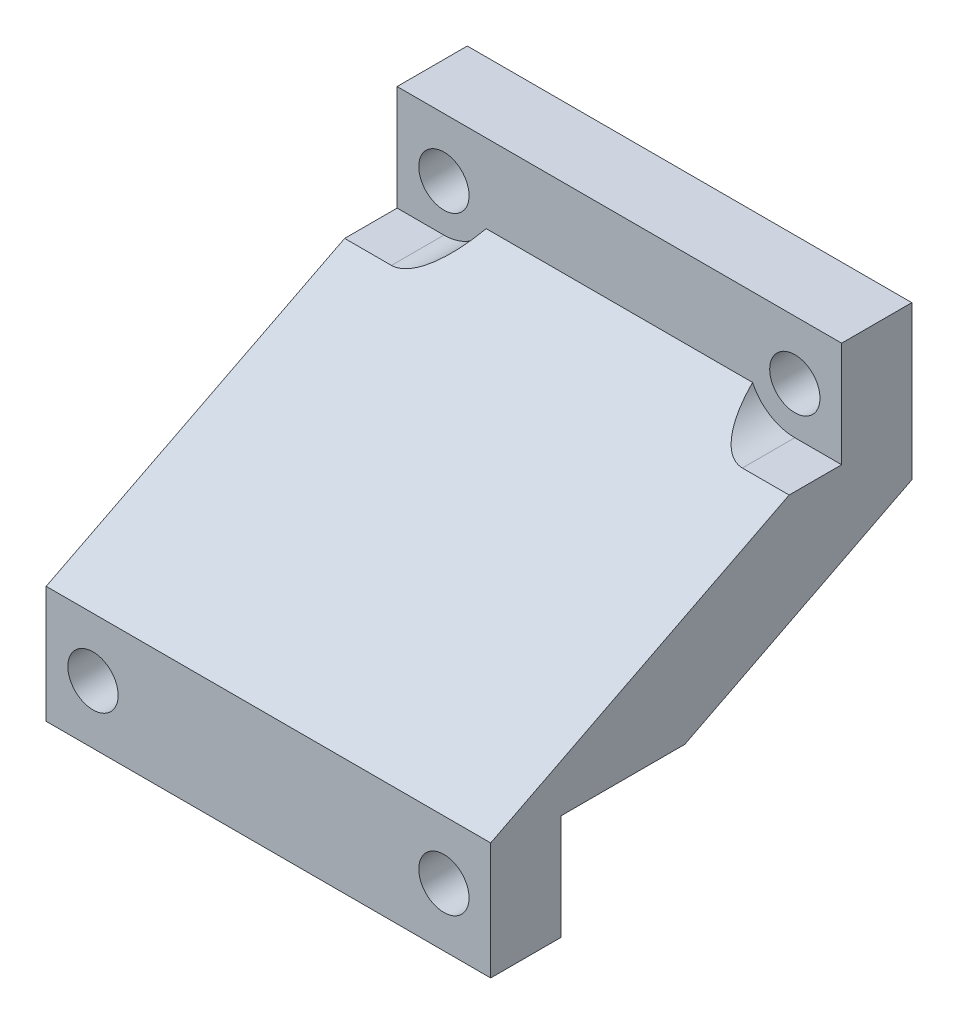
ISO-10303-21;
HEADER;
FILE_DESCRIPTION(('STEP AP214'),'2;1');
FILE_NAME('part.step','',(''),(''),'','','');
FILE_SCHEMA(('AUTOMOTIVE_DESIGN { 1 0 10303 214 1 1 1 1 }'));
ENDSEC;
DATA;
#1=APPLICATION_CONTEXT('core data for automotive mechanical design processes');
#2=APPLICATION_PROTOCOL_DEFINITION('international standard','automotive_design',2000,#1);
#3=PRODUCT_CONTEXT('',#1,'mechanical');
#4=PRODUCT('Part','Part','',(#3));
#5=PRODUCT_RELATED_PRODUCT_CATEGORY('part','',(#4));
#6=PRODUCT_DEFINITION_FORMATION('','',#4);
#7=PRODUCT_DEFINITION_CONTEXT('part definition',#1,'design');
#8=PRODUCT_DEFINITION('design','',#6,#7);
#9=PRODUCT_DEFINITION_SHAPE('','',#8);
#10=(LENGTH_UNIT() NAMED_UNIT(*) SI_UNIT(.MILLI.,.METRE.));
#11=(NAMED_UNIT(*) PLANE_ANGLE_UNIT() SI_UNIT($,.RADIAN.));
#12=(NAMED_UNIT(*) SI_UNIT($,.STERADIAN.) SOLID_ANGLE_UNIT());
#13=UNCERTAINTY_MEASURE_WITH_UNIT(LENGTH_MEASURE(1.E-05),#10,'distance_accuracy_value','');
#14=(GEOMETRIC_REPRESENTATION_CONTEXT(3) GLOBAL_UNCERTAINTY_ASSIGNED_CONTEXT((#13)) GLOBAL_UNIT_ASSIGNED_CONTEXT((#10,
#11,#12)) REPRESENTATION_CONTEXT('',''));
#15=CARTESIAN_POINT('',(0.,0.,0.));
#16=DIRECTION('',(0.,0.,1.));
#17=DIRECTION('',(1.,0.,0.));
#18=AXIS2_PLACEMENT_3D('',#15,#16,#17);
#19=CARTESIAN_POINT('',(-19.,0.,0.));
#20=DIRECTION('',(1.,0.,0.));
#21=DIRECTION('',(0.,0.,-1.));
#22=AXIS2_PLACEMENT_3D('',#19,#20,#21);
#23=PLANE('',#22);
#24=DIRECTION('',(0.,0.,-1.));
#25=VECTOR('',#24,1.);
#26=CARTESIAN_POINT('',(-19.,23.,5.99999999999999));
#27=LINE('',#26,#25);
#28=CARTESIAN_POINT('',(-19.,23.,-25.5139365715669));
#29=VERTEX_POINT('',#28);
#30=CARTESIAN_POINT('',(-19.,23.,-30.));
#31=VERTEX_POINT('',#30);
#32=EDGE_CURVE('E195',#29,#31,#27,.T.);
#33=ORIENTED_EDGE('',*,*,#32,.T.);
#34=DIRECTION('',(0.,-1.,0.));
#35=VECTOR('',#34,1.);
#36=CARTESIAN_POINT('',(-19.,32.,-30.));
#37=LINE('',#36,#35);
#38=CARTESIAN_POINT('',(-19.,32.,-30.));
#39=VERTEX_POINT('',#38);
#40=EDGE_CURVE('E138',#39,#31,#37,.T.);
#41=ORIENTED_EDGE('',*,*,#40,.F.);
#42=DIRECTION('',(0.,0.,1.));
#43=VECTOR('',#42,1.);
#44=CARTESIAN_POINT('',(-19.,32.,-36.));
#45=LINE('',#44,#43);
#46=CARTESIAN_POINT('',(-19.,32.,-36.));
#47=VERTEX_POINT('',#46);
#48=EDGE_CURVE('E135',#47,#39,#45,.T.);
#49=ORIENTED_EDGE('',*,*,#48,.F.);
#50=DIRECTION('',(0.,1.,0.));
#51=VECTOR('',#50,1.);
#52=CARTESIAN_POINT('',(-19.,18.8857634848329,-36.));
#53=LINE('',#52,#51);
#54=CARTESIAN_POINT('',(-19.,18.8857634848329,-36.));
#55=VERTEX_POINT('',#54);
#56=EDGE_CURVE('E133',#55,#47,#53,.T.);
#57=ORIENTED_EDGE('',*,*,#56,.F.);
#58=DIRECTION('',(0.,0.453990499739548,-0.891006524188367));
#59=VECTOR('',#58,1.);
#60=CARTESIAN_POINT('',(-19.,3.6,-6.));
#61=LINE('',#60,#59);
#62=CARTESIAN_POINT('',(-19.,9.,-16.5980967297278));
#63=VERTEX_POINT('',#62);
#64=EDGE_CURVE('E130',#63,#55,#61,.T.);
#65=ORIENTED_EDGE('',*,*,#64,.F.);
#66=DIRECTION('',(0.,0.,-1.));
#67=VECTOR('',#66,1.);
#68=CARTESIAN_POINT('',(-19.,9.,0.));
#69=LINE('',#68,#67);
#70=CARTESIAN_POINT('',(-19.,9.,-6.));
#71=VERTEX_POINT('',#70);
#72=EDGE_CURVE('E161',#71,#63,#69,.T.);
#73=ORIENTED_EDGE('',*,*,#72,.F.);
#74=DIRECTION('',(0.,1.,0.));
#75=VECTOR('',#74,1.);
#76=CARTESIAN_POINT('',(-19.,0.,-6.));
#77=LINE('',#76,#75);
#78=CARTESIAN_POINT('',(-19.,0.,-6.));
#79=VERTEX_POINT('',#78);
#80=EDGE_CURVE('E128',#79,#71,#77,.T.);
#81=ORIENTED_EDGE('',*,*,#80,.F.);
#82=DIRECTION('',(0.,0.,-1.));
#83=VECTOR('',#82,1.);
#84=CARTESIAN_POINT('',(-19.,0.,0.));
#85=LINE('',#84,#83);
#86=CARTESIAN_POINT('',(-19.,0.,0.));
#87=VERTEX_POINT('',#86);
#88=EDGE_CURVE('E144',#87,#79,#85,.T.);
#89=ORIENTED_EDGE('',*,*,#88,.F.);
#90=DIRECTION('',(0.,1.,0.));
#91=VECTOR('',#90,1.);
#92=CARTESIAN_POINT('',(-19.,0.,0.));
#93=LINE('',#92,#91);
#94=CARTESIAN_POINT('',(-19.,10.,0.));
#95=VERTEX_POINT('',#94);
#96=EDGE_CURVE('E142',#87,#95,#93,.T.);
#97=ORIENTED_EDGE('',*,*,#96,.T.);
#98=DIRECTION('',(0.,-0.453990499739548,0.891006524188367));
#99=VECTOR('',#98,1.);
#100=CARTESIAN_POINT('',(-19.,25.2857634848329,-30.));
#101=LINE('',#100,#99);
#102=EDGE_CURVE('E117',#29,#95,#101,.T.);
#103=ORIENTED_EDGE('',*,*,#102,.F.);
#104=EDGE_LOOP('',(#33,#41,#49,#57,#65,#73,#81,#89,#97,#103));
#105=FACE_BOUND('',#104,.T.);
#106=ADVANCED_FACE('F33',(#105),#23,.F.);
#107=CARTESIAN_POINT('',(19.,25.2857634848329,-30.));
#108=DIRECTION('',(0.,-0.891006524188367,-0.453990499739548));
#109=DIRECTION('',(0.,0.453990499739548,-0.891006524188367));
#110=AXIS2_PLACEMENT_3D('',#107,#108,#109);
#111=PLANE('',#110);
#112=DIRECTION('',(-1.,0.,0.));
#113=VECTOR('',#112,1.);
#114=CARTESIAN_POINT('',(19.,25.2857634848329,-30.));
#115=LINE('',#114,#113);
#116=CARTESIAN_POINT('',(11.3859450515982,25.2857634848329,-30.));
#117=VERTEX_POINT('',#116);
#118=CARTESIAN_POINT('',(-11.3859450515982,25.2857634848329,-30.));
#119=VERTEX_POINT('',#118);
#120=EDGE_CURVE('E121',#117,#119,#115,.T.);
#121=ORIENTED_EDGE('',*,*,#120,.T.);
#122=CARTESIAN_POINT('',(-15.,27.,-33.3643785935875));
#123=DIRECTION('',(0.,-0.891006524188367,-0.453990499739548));
#124=DIRECTION('',(0.,0.453990499739548,-0.891006524188367));
#125=AXIS2_PLACEMENT_3D('',#122,#123,#124);
#126=ELLIPSE('',#125,8.81075705834104,4.);
#127=CARTESIAN_POINT('',(-15.,23.,-25.5139365715669));
#128=VERTEX_POINT('',#127);
#129=EDGE_CURVE('E11',#119,#128,#126,.T.);
#130=ORIENTED_EDGE('',*,*,#129,.T.);
#131=DIRECTION('',(1.,0.,0.));
#132=VECTOR('',#131,1.);
#133=CARTESIAN_POINT('',(19.,23.,-25.5139365715669));
#134=LINE('',#133,#132);
#135=EDGE_CURVE('E42',#29,#128,#134,.T.);
#136=ORIENTED_EDGE('',*,*,#135,.F.);
#137=ORIENTED_EDGE('',*,*,#102,.T.);
#138=DIRECTION('',(-1.,0.,0.));
#139=VECTOR('',#138,1.);
#140=CARTESIAN_POINT('',(19.,10.,0.));
#141=LINE('',#140,#139);
#142=CARTESIAN_POINT('',(19.,10.,0.));
#143=VERTEX_POINT('',#142);
#144=EDGE_CURVE('E112',#143,#95,#141,.T.);
#145=ORIENTED_EDGE('',*,*,#144,.F.);
#146=DIRECTION('',(0.,-0.453990499739548,0.891006524188367));
#147=VECTOR('',#146,1.);
#148=CARTESIAN_POINT('',(19.,25.2857634848329,-30.));
#149=LINE('',#148,#147);
#150=CARTESIAN_POINT('',(19.,23.,-25.5139365715669));
#151=VERTEX_POINT('',#150);
#152=EDGE_CURVE('E98',#151,#143,#149,.T.);
#153=ORIENTED_EDGE('',*,*,#152,.F.);
#154=DIRECTION('',(-1.,0.,0.));
#155=VECTOR('',#154,1.);
#156=CARTESIAN_POINT('',(19.,23.,-25.5139365715669));
#157=LINE('',#156,#155);
#158=CARTESIAN_POINT('',(15.,23.,-25.5139365715669));
#159=VERTEX_POINT('',#158);
#160=EDGE_CURVE('E178',#151,#159,#157,.T.);
#161=ORIENTED_EDGE('',*,*,#160,.T.);
#162=CARTESIAN_POINT('',(15.,27.,-33.3643785935875));
#163=DIRECTION('',(0.,-0.891006524188367,-0.453990499739548));
#164=DIRECTION('',(0.,0.453990499739548,-0.891006524188367));
#165=AXIS2_PLACEMENT_3D('',#162,#163,#164);
#166=ELLIPSE('',#165,8.81075705834104,4.);
#167=EDGE_CURVE('E180',#117,#159,#166,.F.);
#168=ORIENTED_EDGE('',*,*,#167,.F.);
#169=EDGE_LOOP('',(#121,#130,#136,#137,#145,#153,#161,#168));
#170=FACE_BOUND('',#169,.T.);
#171=ADVANCED_FACE('F114',(#170),#111,.F.);
#172=CARTESIAN_POINT('',(15.,27.,-36.));
#173=DIRECTION('',(0.,0.,1.));
#174=DIRECTION('',(1.,0.,0.));
#175=AXIS2_PLACEMENT_3D('',#172,#173,#174);
#176=CYLINDRICAL_SURFACE('',#175,2.15);
#177=CARTESIAN_POINT('',(15.,27.,-36.));
#178=DIRECTION('',(0.,0.,1.));
#179=DIRECTION('',(-1.,0.,0.));
#180=AXIS2_PLACEMENT_3D('',#177,#178,#179);
#181=CIRCLE('',#180,2.15);
#182=CARTESIAN_POINT('',(12.85,27.,-36.));
#183=VERTEX_POINT('',#182);
#184=EDGE_CURVE('E302',#183,#183,#181,.T.);
#185=ORIENTED_EDGE('',*,*,#184,.F.);
#186=EDGE_LOOP('',(#185));
#187=FACE_BOUND('',#186,.T.);
#188=CARTESIAN_POINT('',(15.,27.,-30.));
#189=DIRECTION('',(0.,0.,-1.));
#190=DIRECTION('',(-1.,0.,0.));
#191=AXIS2_PLACEMENT_3D('',#188,#189,#190);
#192=CIRCLE('',#191,2.15);
#193=CARTESIAN_POINT('',(12.85,27.,-30.));
#194=VERTEX_POINT('',#193);
#195=EDGE_CURVE('E309',#194,#194,#192,.T.);
#196=ORIENTED_EDGE('',*,*,#195,.F.);
#197=EDGE_LOOP('',(#196));
#198=FACE_BOUND('',#197,.T.);
#199=ADVANCED_FACE('F383',(#187,#198),#176,.F.);
#200=CARTESIAN_POINT('',(19.,3.6,-6.));
#201=DIRECTION('',(0.,0.891006524188367,0.453990499739548));
#202=DIRECTION('',(0.,-0.453990499739548,0.891006524188367));
#203=AXIS2_PLACEMENT_3D('',#200,#201,#202);
#204=PLANE('',#203);
#205=DIRECTION('',(0.,0.453990499739548,-0.891006524188367));
#206=VECTOR('',#205,1.);
#207=CARTESIAN_POINT('',(11.,3.6,-6.));
#208=LINE('',#207,#206);
#209=CARTESIAN_POINT('',(11.,3.6,-6.));
#210=VERTEX_POINT('',#209);
#211=CARTESIAN_POINT('',(11.,4.99999999999997,-8.74765470770715));
#212=VERTEX_POINT('',#211);
#213=EDGE_CURVE('E175',#210,#212,#208,.T.);
#214=ORIENTED_EDGE('',*,*,#213,.F.);
#215=DIRECTION('',(-1.,0.,0.));
#216=VECTOR('',#215,1.);
#217=CARTESIAN_POINT('',(19.,3.6,-6.));
#218=LINE('',#217,#216);
#219=CARTESIAN_POINT('',(-11.,3.6,-6.));
#220=VERTEX_POINT('',#219);
#221=EDGE_CURVE('E158',#210,#220,#218,.T.);
#222=ORIENTED_EDGE('',*,*,#221,.T.);
#223=DIRECTION('',(0.,-0.453990499739548,0.891006524188367));
#224=VECTOR('',#223,1.);
#225=CARTESIAN_POINT('',(-11.,3.6,-6.));
#226=LINE('',#225,#224);
#227=CARTESIAN_POINT('',(-11.,4.99999999999997,-8.74765470770715));
#228=VERTEX_POINT('',#227);
#229=EDGE_CURVE('E166',#228,#220,#226,.T.);
#230=ORIENTED_EDGE('',*,*,#229,.F.);
#231=CARTESIAN_POINT('',(-15.,5.,-8.74765470770719));
#232=DIRECTION('',(0.,0.891006524188367,0.453990499739548));
#233=DIRECTION('',(0.,-0.453990499739548,0.891006524188367));
#234=AXIS2_PLACEMENT_3D('',#231,#232,#233);
#235=ELLIPSE('',#234,8.81075705834104,4.);
#236=CARTESIAN_POINT('',(-15.,9.,-16.5980967297278));
#237=VERTEX_POINT('',#236);
#238=EDGE_CURVE('E169',#237,#228,#235,.F.);
#239=ORIENTED_EDGE('',*,*,#238,.F.);
#240=DIRECTION('',(1.,0.,0.));
#241=VECTOR('',#240,1.);
#242=CARTESIAN_POINT('',(19.,9.,-16.5980967297278));
#243=LINE('',#242,#241);
#244=EDGE_CURVE('E281',#63,#237,#243,.T.);
#245=ORIENTED_EDGE('',*,*,#244,.F.);
#246=ORIENTED_EDGE('',*,*,#64,.T.);
#247=DIRECTION('',(-1.,0.,0.));
#248=VECTOR('',#247,1.);
#249=CARTESIAN_POINT('',(19.,18.8857634848329,-36.));
#250=LINE('',#249,#248);
#251=CARTESIAN_POINT('',(19.,18.8857634848329,-36.));
#252=VERTEX_POINT('',#251);
#253=EDGE_CURVE('E155',#252,#55,#250,.T.);
#254=ORIENTED_EDGE('',*,*,#253,.F.);
#255=DIRECTION('',(0.,0.453990499739548,-0.891006524188367));
#256=VECTOR('',#255,1.);
#257=CARTESIAN_POINT('',(19.,3.6,-6.));
#258=LINE('',#257,#256);
#259=CARTESIAN_POINT('',(19.,9.,-16.5980967297278));
#260=VERTEX_POINT('',#259);
#261=EDGE_CURVE('E87',#260,#252,#258,.T.);
#262=ORIENTED_EDGE('',*,*,#261,.F.);
#263=DIRECTION('',(1.,0.,0.));
#264=VECTOR('',#263,1.);
#265=CARTESIAN_POINT('',(19.,9.,-16.5980967297278));
#266=LINE('',#265,#264);
#267=CARTESIAN_POINT('',(15.,9.,-16.5980967297278));
#268=VERTEX_POINT('',#267);
#269=EDGE_CURVE('E286',#268,#260,#266,.T.);
#270=ORIENTED_EDGE('',*,*,#269,.F.);
#271=CARTESIAN_POINT('',(15.,5.,-8.74765470770719));
#272=DIRECTION('',(0.,0.891006524188367,0.453990499739548));
#273=DIRECTION('',(0.,-0.453990499739548,0.891006524188367));
#274=AXIS2_PLACEMENT_3D('',#271,#272,#273);
#275=ELLIPSE('',#274,8.81075705834104,4.);
#276=EDGE_CURVE('E172',#212,#268,#275,.F.);
#277=ORIENTED_EDGE('',*,*,#276,.F.);
#278=EDGE_LOOP('',(#214,#222,#230,#239,#245,#246,#254,#262,#270,#277));
#279=FACE_BOUND('',#278,.T.);
#280=ADVANCED_FACE('F285',(#279),#204,.F.);
#281=CARTESIAN_POINT('',(19.,0.,0.));
#282=DIRECTION('',(1.,0.,0.));
#283=DIRECTION('',(0.,0.,-1.));
#284=AXIS2_PLACEMENT_3D('',#281,#282,#283);
#285=PLANE('',#284);
#286=DIRECTION('',(0.,0.,-1.));
#287=VECTOR('',#286,1.);
#288=CARTESIAN_POINT('',(19.,23.,5.99999999999999));
#289=LINE('',#288,#287);
#290=CARTESIAN_POINT('',(19.,23.,-30.));
#291=VERTEX_POINT('',#290);
#292=EDGE_CURVE('E106',#151,#291,#289,.T.);
#293=ORIENTED_EDGE('',*,*,#292,.F.);
#294=ORIENTED_EDGE('',*,*,#152,.T.);
#295=DIRECTION('',(0.,1.,0.));
#296=VECTOR('',#295,1.);
#297=CARTESIAN_POINT('',(19.,0.,0.));
#298=LINE('',#297,#296);
#299=CARTESIAN_POINT('',(19.,0.,0.));
#300=VERTEX_POINT('',#299);
#301=EDGE_CURVE('E102',#300,#143,#298,.T.);
#302=ORIENTED_EDGE('',*,*,#301,.F.);
#303=DIRECTION('',(0.,0.,-1.));
#304=VECTOR('',#303,1.);
#305=CARTESIAN_POINT('',(19.,0.,0.));
#306=LINE('',#305,#304);
#307=CARTESIAN_POINT('',(19.,0.,-6.));
#308=VERTEX_POINT('',#307);
#309=EDGE_CURVE('E50',#300,#308,#306,.T.);
#310=ORIENTED_EDGE('',*,*,#309,.T.);
#311=DIRECTION('',(0.,1.,0.));
#312=VECTOR('',#311,1.);
#313=CARTESIAN_POINT('',(19.,0.,-6.));
#314=LINE('',#313,#312);
#315=CARTESIAN_POINT('',(19.,9.,-6.));
#316=VERTEX_POINT('',#315);
#317=EDGE_CURVE('E146',#308,#316,#314,.T.);
#318=ORIENTED_EDGE('',*,*,#317,.T.);
#319=DIRECTION('',(0.,0.,-1.));
#320=VECTOR('',#319,1.);
#321=CARTESIAN_POINT('',(19.,9.,0.));
#322=LINE('',#321,#320);
#323=EDGE_CURVE('E164',#316,#260,#322,.T.);
#324=ORIENTED_EDGE('',*,*,#323,.T.);
#325=ORIENTED_EDGE('',*,*,#261,.T.);
#326=DIRECTION('',(0.,1.,0.));
#327=VECTOR('',#326,1.);
#328=CARTESIAN_POINT('',(19.,18.8857634848329,-36.));
#329=LINE('',#328,#327);
#330=CARTESIAN_POINT('',(19.,32.,-36.));
#331=VERTEX_POINT('',#330);
#332=EDGE_CURVE('E318',#252,#331,#329,.T.);
#333=ORIENTED_EDGE('',*,*,#332,.T.);
#334=DIRECTION('',(0.,0.,1.));
#335=VECTOR('',#334,1.);
#336=CARTESIAN_POINT('',(19.,32.,-36.));
#337=LINE('',#336,#335);
#338=CARTESIAN_POINT('',(19.,32.,-30.));
#339=VERTEX_POINT('',#338);
#340=EDGE_CURVE('E320',#331,#339,#337,.T.);
#341=ORIENTED_EDGE('',*,*,#340,.T.);
#342=DIRECTION('',(0.,-1.,0.));
#343=VECTOR('',#342,1.);
#344=CARTESIAN_POINT('',(19.,32.,-30.));
#345=LINE('',#344,#343);
#346=EDGE_CURVE('E109',#339,#291,#345,.T.);
#347=ORIENTED_EDGE('',*,*,#346,.T.);
#348=EDGE_LOOP('',(#293,#294,#302,#310,#318,#324,#325,#333,#341,#347));
#349=FACE_BOUND('',#348,.T.);
#350=ADVANCED_FACE('F100',(#349),#285,.T.);
#351=CARTESIAN_POINT('',(19.,0.,-6.));
#352=DIRECTION('',(0.,0.,1.));
#353=DIRECTION('',(1.,0.,0.));
#354=AXIS2_PLACEMENT_3D('',#351,#352,#353);
#355=PLANE('',#354);
#356=CARTESIAN_POINT('',(-15.,5.,-6.));
#357=DIRECTION('',(0.,0.,1.));
#358=DIRECTION('',(1.,0.,0.));
#359=AXIS2_PLACEMENT_3D('',#356,#357,#358);
#360=CIRCLE('',#359,2.15);
#361=CARTESIAN_POINT('',(-12.85,5.,-6.));
#362=VERTEX_POINT('',#361);
#363=EDGE_CURVE('E300',#362,#362,#360,.F.);
#364=ORIENTED_EDGE('',*,*,#363,.F.);
#365=EDGE_LOOP('',(#364));
#366=FACE_BOUND('',#365,.T.);
#367=DIRECTION('',(0.,-1.,0.));
#368=VECTOR('',#367,1.);
#369=CARTESIAN_POINT('',(-11.,4.99999999999997,-6.));
#370=LINE('',#369,#368);
#371=CARTESIAN_POINT('',(-11.,4.99999999999997,-6.));
#372=VERTEX_POINT('',#371);
#373=EDGE_CURVE('E349',#372,#220,#370,.T.);
#374=ORIENTED_EDGE('',*,*,#373,.T.);
#375=ORIENTED_EDGE('',*,*,#221,.F.);
#376=DIRECTION('',(0.,1.,0.));
#377=VECTOR('',#376,1.);
#378=CARTESIAN_POINT('',(11.,4.99999999999997,-6.));
#379=LINE('',#378,#377);
#380=CARTESIAN_POINT('',(11.,4.99999999999997,-6.));
#381=VERTEX_POINT('',#380);
#382=EDGE_CURVE('E271',#210,#381,#379,.T.);
#383=ORIENTED_EDGE('',*,*,#382,.T.);
#384=CARTESIAN_POINT('',(15.,5.,-6.));
#385=DIRECTION('',(0.,0.,-1.));
#386=DIRECTION('',(1.,0.,0.));
#387=AXIS2_PLACEMENT_3D('',#384,#385,#386);
#388=CIRCLE('',#387,4.);
#389=CARTESIAN_POINT('',(15.,9.,-6.));
#390=VERTEX_POINT('',#389);
#391=EDGE_CURVE('E280',#381,#390,#388,.T.);
#392=ORIENTED_EDGE('',*,*,#391,.T.);
#393=DIRECTION('',(1.,0.,0.));
#394=VECTOR('',#393,1.);
#395=CARTESIAN_POINT('',(19.,9.,-6.));
#396=LINE('',#395,#394);
#397=EDGE_CURVE('E339',#390,#316,#396,.T.);
#398=ORIENTED_EDGE('',*,*,#397,.T.);
#399=ORIENTED_EDGE('',*,*,#317,.F.);
#400=DIRECTION('',(-1.,0.,0.));
#401=VECTOR('',#400,1.);
#402=CARTESIAN_POINT('',(19.,0.,-6.));
#403=LINE('',#402,#401);
#404=EDGE_CURVE('E80',#308,#79,#403,.T.);
#405=ORIENTED_EDGE('',*,*,#404,.T.);
#406=ORIENTED_EDGE('',*,*,#80,.T.);
#407=DIRECTION('',(1.,0.,0.));
#408=VECTOR('',#407,1.);
#409=CARTESIAN_POINT('',(-19.,9.,-6.));
#410=LINE('',#409,#408);
#411=CARTESIAN_POINT('',(-15.,9.,-6.));
#412=VERTEX_POINT('',#411);
#413=EDGE_CURVE('E343',#71,#412,#410,.T.);
#414=ORIENTED_EDGE('',*,*,#413,.T.);
#415=CARTESIAN_POINT('',(-15.,5.,-6.));
#416=DIRECTION('',(0.,0.,-1.));
#417=DIRECTION('',(-1.,0.,0.));
#418=AXIS2_PLACEMENT_3D('',#415,#416,#417);
#419=CIRCLE('',#418,4.);
#420=EDGE_CURVE('E346',#412,#372,#419,.T.);
#421=ORIENTED_EDGE('',*,*,#420,.T.);
#422=EDGE_LOOP('',(#374,#375,#383,#392,#398,#399,#405,#406,#414,#421));
#423=FACE_BOUND('',#422,.T.);
#424=CARTESIAN_POINT('',(15.,5.,-6.));
#425=DIRECTION('',(0.,0.,1.));
#426=DIRECTION('',(1.,0.,0.));
#427=AXIS2_PLACEMENT_3D('',#424,#425,#426);
#428=CIRCLE('',#427,2.15);
#429=CARTESIAN_POINT('',(17.15,5.,-6.));
#430=VERTEX_POINT('',#429);
#431=EDGE_CURVE('E292',#430,#430,#428,.F.);
#432=ORIENTED_EDGE('',*,*,#431,.F.);
#433=EDGE_LOOP('',(#432));
#434=FACE_BOUND('',#433,.T.);
#435=ADVANCED_FACE('F35',(#366,#423,#434),#355,.F.);
#436=CARTESIAN_POINT('',(19.,18.8857634848329,-36.));
#437=DIRECTION('',(0.,0.,1.));
#438=DIRECTION('',(1.,0.,0.));
#439=AXIS2_PLACEMENT_3D('',#436,#437,#438);
#440=PLANE('',#439);
#441=CARTESIAN_POINT('',(-15.,27.,-36.));
#442=DIRECTION('',(0.,0.,1.));
#443=DIRECTION('',(1.,0.,0.));
#444=AXIS2_PLACEMENT_3D('',#441,#442,#443);
#445=CIRCLE('',#444,2.15);
#446=CARTESIAN_POINT('',(-12.85,27.,-36.));
#447=VERTEX_POINT('',#446);
#448=EDGE_CURVE('E306',#447,#447,#445,.T.);
#449=ORIENTED_EDGE('',*,*,#448,.T.);
#450=EDGE_LOOP('',(#449));
#451=FACE_BOUND('',#450,.T.);
#452=ORIENTED_EDGE('',*,*,#184,.T.);
#453=EDGE_LOOP('',(#452));
#454=FACE_BOUND('',#453,.T.);
#455=ORIENTED_EDGE('',*,*,#56,.T.);
#456=DIRECTION('',(-1.,0.,0.));
#457=VECTOR('',#456,1.);
#458=CARTESIAN_POINT('',(19.,32.,-36.));
#459=LINE('',#458,#457);
#460=EDGE_CURVE('E152',#331,#47,#459,.T.);
#461=ORIENTED_EDGE('',*,*,#460,.F.);
#462=ORIENTED_EDGE('',*,*,#332,.F.);
#463=ORIENTED_EDGE('',*,*,#253,.T.);
#464=EDGE_LOOP('',(#455,#461,#462,#463));
#465=FACE_BOUND('',#464,.T.);
#466=ADVANCED_FACE('F400',(#451,#454,#465),#440,.F.);
#467=CARTESIAN_POINT('',(19.,32.,-36.));
#468=DIRECTION('',(0.,-1.,0.));
#469=DIRECTION('',(0.,0.,-1.));
#470=AXIS2_PLACEMENT_3D('',#467,#468,#469);
#471=PLANE('',#470);
#472=ORIENTED_EDGE('',*,*,#48,.T.);
#473=DIRECTION('',(-1.,0.,0.));
#474=VECTOR('',#473,1.);
#475=CARTESIAN_POINT('',(19.,32.,-30.));
#476=LINE('',#475,#474);
#477=EDGE_CURVE('E150',#339,#39,#476,.T.);
#478=ORIENTED_EDGE('',*,*,#477,.F.);
#479=ORIENTED_EDGE('',*,*,#340,.F.);
#480=ORIENTED_EDGE('',*,*,#460,.T.);
#481=EDGE_LOOP('',(#472,#478,#479,#480));
#482=FACE_BOUND('',#481,.T.);
#483=ADVANCED_FACE('F397',(#482),#471,.F.);
#484=CARTESIAN_POINT('',(19.,32.,-30.));
#485=DIRECTION('',(0.,0.,-1.));
#486=DIRECTION('',(-1.,0.,0.));
#487=AXIS2_PLACEMENT_3D('',#484,#485,#486);
#488=PLANE('',#487);
#489=CARTESIAN_POINT('',(-15.,27.,-30.));
#490=DIRECTION('',(0.,0.,-1.));
#491=DIRECTION('',(-1.,0.,0.));
#492=AXIS2_PLACEMENT_3D('',#489,#490,#491);
#493=CIRCLE('',#492,4.);
#494=CARTESIAN_POINT('',(-15.,23.,-30.));
#495=VERTEX_POINT('',#494);
#496=EDGE_CURVE('E203',#119,#495,#493,.T.);
#497=ORIENTED_EDGE('',*,*,#496,.F.);
#498=ORIENTED_EDGE('',*,*,#120,.F.);
#499=CARTESIAN_POINT('',(15.,27.,-30.));
#500=DIRECTION('',(0.,0.,1.));
#501=DIRECTION('',(1.,0.,0.));
#502=AXIS2_PLACEMENT_3D('',#499,#500,#501);
#503=CIRCLE('',#502,4.);
#504=CARTESIAN_POINT('',(15.,23.,-30.));
#505=VERTEX_POINT('',#504);
#506=EDGE_CURVE('E219',#117,#505,#503,.T.);
#507=ORIENTED_EDGE('',*,*,#506,.T.);
#508=DIRECTION('',(-1.,0.,0.));
#509=VECTOR('',#508,1.);
#510=CARTESIAN_POINT('',(19.,23.,-30.));
#511=LINE('',#510,#509);
#512=EDGE_CURVE('E329',#291,#505,#511,.T.);
#513=ORIENTED_EDGE('',*,*,#512,.F.);
#514=ORIENTED_EDGE('',*,*,#346,.F.);
#515=ORIENTED_EDGE('',*,*,#477,.T.);
#516=ORIENTED_EDGE('',*,*,#40,.T.);
#517=DIRECTION('',(1.,0.,0.));
#518=VECTOR('',#517,1.);
#519=CARTESIAN_POINT('',(-19.,23.,-30.));
#520=LINE('',#519,#518);
#521=EDGE_CURVE('E205',#31,#495,#520,.T.);
#522=ORIENTED_EDGE('',*,*,#521,.T.);
#523=EDGE_LOOP('',(#497,#498,#507,#513,#514,#515,#516,#522));
#524=FACE_BOUND('',#523,.T.);
#525=ORIENTED_EDGE('',*,*,#195,.T.);
#526=EDGE_LOOP('',(#525));
#527=FACE_BOUND('',#526,.T.);
#528=CARTESIAN_POINT('',(-15.,27.,-30.));
#529=DIRECTION('',(0.,0.,-1.));
#530=DIRECTION('',(-1.,0.,0.));
#531=AXIS2_PLACEMENT_3D('',#528,#529,#530);
#532=CIRCLE('',#531,2.15);
#533=CARTESIAN_POINT('',(-17.15,27.,-30.));
#534=VERTEX_POINT('',#533);
#535=EDGE_CURVE('E131',#534,#534,#532,.T.);
#536=ORIENTED_EDGE('',*,*,#535,.T.);
#537=EDGE_LOOP('',(#536));
#538=FACE_BOUND('',#537,.T.);
#539=ADVANCED_FACE('F214',(#524,#527,#538),#488,.F.);
#540=CARTESIAN_POINT('',(19.,0.,0.));
#541=DIRECTION('',(0.,0.,1.));
#542=DIRECTION('',(0.,-1.,0.));
#543=AXIS2_PLACEMENT_3D('',#540,#541,#542);
#544=PLANE('',#543);
#545=CARTESIAN_POINT('',(-15.,5.,0.));
#546=DIRECTION('',(0.,0.,1.));
#547=DIRECTION('',(1.,0.,0.));
#548=AXIS2_PLACEMENT_3D('',#545,#546,#547);
#549=CIRCLE('',#548,2.15);
#550=CARTESIAN_POINT('',(-12.85,5.,0.));
#551=VERTEX_POINT('',#550);
#552=EDGE_CURVE('E297',#551,#551,#549,.T.);
#553=ORIENTED_EDGE('',*,*,#552,.F.);
#554=EDGE_LOOP('',(#553));
#555=FACE_BOUND('',#554,.T.);
#556=CARTESIAN_POINT('',(15.,5.,0.));
#557=DIRECTION('',(0.,0.,1.));
#558=DIRECTION('',(-1.,0.,0.));
#559=AXIS2_PLACEMENT_3D('',#556,#557,#558);
#560=CIRCLE('',#559,2.15);
#561=CARTESIAN_POINT('',(12.85,5.,0.));
#562=VERTEX_POINT('',#561);
#563=EDGE_CURVE('E289',#562,#562,#560,.T.);
#564=ORIENTED_EDGE('',*,*,#563,.F.);
#565=EDGE_LOOP('',(#564));
#566=FACE_BOUND('',#565,.T.);
#567=ORIENTED_EDGE('',*,*,#96,.F.);
#568=DIRECTION('',(-1.,0.,0.));
#569=VECTOR('',#568,1.);
#570=CARTESIAN_POINT('',(19.,0.,0.));
#571=LINE('',#570,#569);
#572=EDGE_CURVE('E73',#300,#87,#571,.T.);
#573=ORIENTED_EDGE('',*,*,#572,.F.);
#574=ORIENTED_EDGE('',*,*,#301,.T.);
#575=ORIENTED_EDGE('',*,*,#144,.T.);
#576=EDGE_LOOP('',(#567,#573,#574,#575));
#577=FACE_BOUND('',#576,.T.);
#578=ADVANCED_FACE('F123',(#555,#566,#577),#544,.T.);
#579=CARTESIAN_POINT('',(19.,0.,0.));
#580=DIRECTION('',(0.,1.,0.));
#581=DIRECTION('',(0.,0.,1.));
#582=AXIS2_PLACEMENT_3D('',#579,#580,#581);
#583=PLANE('',#582);
#584=ORIENTED_EDGE('',*,*,#88,.T.);
#585=ORIENTED_EDGE('',*,*,#404,.F.);
#586=ORIENTED_EDGE('',*,*,#309,.F.);
#587=ORIENTED_EDGE('',*,*,#572,.T.);
#588=EDGE_LOOP('',(#584,#585,#586,#587));
#589=FACE_BOUND('',#588,.T.);
#590=ADVANCED_FACE('F388',(#589),#583,.F.);
#591=CARTESIAN_POINT('',(-15.,27.,-36.));
#592=DIRECTION('',(0.,0.,1.));
#593=DIRECTION('',(1.,0.,0.));
#594=AXIS2_PLACEMENT_3D('',#591,#592,#593);
#595=CYLINDRICAL_SURFACE('',#594,2.15);
#596=ORIENTED_EDGE('',*,*,#448,.F.);
#597=EDGE_LOOP('',(#596));
#598=FACE_BOUND('',#597,.T.);
#599=ORIENTED_EDGE('',*,*,#535,.F.);
#600=EDGE_LOOP('',(#599));
#601=FACE_BOUND('',#600,.T.);
#602=ADVANCED_FACE('F391',(#598,#601),#595,.F.);
#603=CARTESIAN_POINT('',(15.,5.,-12.0811183182043));
#604=DIRECTION('',(0.,0.,1.));
#605=DIRECTION('',(1.,0.,0.));
#606=AXIS2_PLACEMENT_3D('',#603,#604,#605);
#607=CYLINDRICAL_SURFACE('',#606,2.15);
#608=ORIENTED_EDGE('',*,*,#431,.T.);
#609=EDGE_LOOP('',(#608));
#610=FACE_BOUND('',#609,.T.);
#611=ORIENTED_EDGE('',*,*,#563,.T.);
#612=EDGE_LOOP('',(#611));
#613=FACE_BOUND('',#612,.T.);
#614=ADVANCED_FACE('F417',(#610,#613),#607,.F.);
#615=CARTESIAN_POINT('',(-15.,5.,-12.0811183182043));
#616=DIRECTION('',(0.,0.,1.));
#617=DIRECTION('',(1.,0.,0.));
#618=AXIS2_PLACEMENT_3D('',#615,#616,#617);
#619=CYLINDRICAL_SURFACE('',#618,2.15);
#620=ORIENTED_EDGE('',*,*,#363,.T.);
#621=EDGE_LOOP('',(#620));
#622=FACE_BOUND('',#621,.T.);
#623=ORIENTED_EDGE('',*,*,#552,.T.);
#624=EDGE_LOOP('',(#623));
#625=FACE_BOUND('',#624,.T.);
#626=ADVANCED_FACE('F421',(#622,#625),#619,.F.);
#627=CARTESIAN_POINT('',(-15.,5.,-36.));
#628=DIRECTION('',(0.,0.,1.));
#629=DIRECTION('',(1.,0.,0.));
#630=AXIS2_PLACEMENT_3D('',#627,#628,#629);
#631=CYLINDRICAL_SURFACE('',#630,4.);
#632=ORIENTED_EDGE('',*,*,#238,.T.);
#633=DIRECTION('',(0.,0.,1.));
#634=VECTOR('',#633,1.);
#635=CARTESIAN_POINT('',(-11.,4.99999999999997,-36.));
#636=LINE('',#635,#634);
#637=EDGE_CURVE('E352',#228,#372,#636,.T.);
#638=ORIENTED_EDGE('',*,*,#637,.T.);
#639=ORIENTED_EDGE('',*,*,#420,.F.);
#640=DIRECTION('',(0.,0.,1.));
#641=VECTOR('',#640,1.);
#642=CARTESIAN_POINT('',(-15.,9.,-36.));
#643=LINE('',#642,#641);
#644=EDGE_CURVE('E337',#237,#412,#643,.T.);
#645=ORIENTED_EDGE('',*,*,#644,.F.);
#646=EDGE_LOOP('',(#632,#638,#639,#645));
#647=FACE_BOUND('',#646,.T.);
#648=ADVANCED_FACE('F362',(#647),#631,.F.);
#649=CARTESIAN_POINT('',(-11.,4.99999999999997,-36.));
#650=DIRECTION('',(-1.,0.,0.));
#651=DIRECTION('',(0.,-1.,0.));
#652=AXIS2_PLACEMENT_3D('',#649,#650,#651);
#653=PLANE('',#652);
#654=ORIENTED_EDGE('',*,*,#229,.T.);
#655=ORIENTED_EDGE('',*,*,#373,.F.);
#656=ORIENTED_EDGE('',*,*,#637,.F.);
#657=EDGE_LOOP('',(#654,#655,#656));
#658=FACE_BOUND('',#657,.T.);
#659=ADVANCED_FACE('F365',(#658),#653,.T.);
#660=CARTESIAN_POINT('',(-19.,9.,-36.));
#661=DIRECTION('',(0.,-1.,0.));
#662=DIRECTION('',(0.,0.,-1.));
#663=AXIS2_PLACEMENT_3D('',#660,#661,#662);
#664=PLANE('',#663);
#665=ORIENTED_EDGE('',*,*,#244,.T.);
#666=ORIENTED_EDGE('',*,*,#644,.T.);
#667=ORIENTED_EDGE('',*,*,#413,.F.);
#668=ORIENTED_EDGE('',*,*,#72,.T.);
#669=EDGE_LOOP('',(#665,#666,#667,#668));
#670=FACE_BOUND('',#669,.T.);
#671=ADVANCED_FACE('F355',(#670),#664,.T.);
#672=CARTESIAN_POINT('',(11.,4.99999999999997,-36.));
#673=DIRECTION('',(1.,0.,0.));
#674=DIRECTION('',(0.,1.,0.));
#675=AXIS2_PLACEMENT_3D('',#672,#673,#674);
#676=PLANE('',#675);
#677=ORIENTED_EDGE('',*,*,#213,.T.);
#678=DIRECTION('',(0.,0.,1.));
#679=VECTOR('',#678,1.);
#680=CARTESIAN_POINT('',(11.,4.99999999999997,-36.));
#681=LINE('',#680,#679);
#682=EDGE_CURVE('E269',#212,#381,#681,.T.);
#683=ORIENTED_EDGE('',*,*,#682,.T.);
#684=ORIENTED_EDGE('',*,*,#382,.F.);
#685=EDGE_LOOP('',(#677,#683,#684));
#686=FACE_BOUND('',#685,.T.);
#687=ADVANCED_FACE('F268',(#686),#676,.T.);
#688=CARTESIAN_POINT('',(15.,5.,-36.));
#689=DIRECTION('',(0.,0.,1.));
#690=DIRECTION('',(1.,0.,0.));
#691=AXIS2_PLACEMENT_3D('',#688,#689,#690);
#692=CYLINDRICAL_SURFACE('',#691,4.);
#693=ORIENTED_EDGE('',*,*,#276,.T.);
#694=DIRECTION('',(0.,0.,1.));
#695=VECTOR('',#694,1.);
#696=CARTESIAN_POINT('',(15.,9.,-36.));
#697=LINE('',#696,#695);
#698=EDGE_CURVE('E282',#268,#390,#697,.T.);
#699=ORIENTED_EDGE('',*,*,#698,.T.);
#700=ORIENTED_EDGE('',*,*,#391,.F.);
#701=ORIENTED_EDGE('',*,*,#682,.F.);
#702=EDGE_LOOP('',(#693,#699,#700,#701));
#703=FACE_BOUND('',#702,.T.);
#704=ADVANCED_FACE('F277',(#703),#692,.F.);
#705=CARTESIAN_POINT('',(19.,9.,-36.));
#706=DIRECTION('',(0.,-1.,0.));
#707=DIRECTION('',(0.,0.,-1.));
#708=AXIS2_PLACEMENT_3D('',#705,#706,#707);
#709=PLANE('',#708);
#710=ORIENTED_EDGE('',*,*,#269,.T.);
#711=ORIENTED_EDGE('',*,*,#323,.F.);
#712=ORIENTED_EDGE('',*,*,#397,.F.);
#713=ORIENTED_EDGE('',*,*,#698,.F.);
#714=EDGE_LOOP('',(#710,#711,#712,#713));
#715=FACE_BOUND('',#714,.T.);
#716=ADVANCED_FACE('F367',(#715),#709,.T.);
#717=CARTESIAN_POINT('',(-15.,27.,5.99999999999999));
#718=DIRECTION('',(0.,0.,-1.));
#719=DIRECTION('',(-1.,0.,0.));
#720=AXIS2_PLACEMENT_3D('',#717,#718,#719);
#721=CYLINDRICAL_SURFACE('',#720,4.);
#722=ORIENTED_EDGE('',*,*,#496,.T.);
#723=DIRECTION('',(0.,0.,-1.));
#724=VECTOR('',#723,1.);
#725=CARTESIAN_POINT('',(-15.,23.,5.99999999999999));
#726=LINE('',#725,#724);
#727=EDGE_CURVE('E191',#128,#495,#726,.T.);
#728=ORIENTED_EDGE('',*,*,#727,.F.);
#729=ORIENTED_EDGE('',*,*,#129,.F.);
#730=EDGE_LOOP('',(#722,#728,#729));
#731=FACE_BOUND('',#730,.T.);
#732=ADVANCED_FACE('F200',(#731),#721,.F.);
#733=CARTESIAN_POINT('',(-19.,23.,5.99999999999999));
#734=DIRECTION('',(0.,1.,0.));
#735=DIRECTION('',(0.,0.,1.));
#736=AXIS2_PLACEMENT_3D('',#733,#734,#735);
#737=PLANE('',#736);
#738=ORIENTED_EDGE('',*,*,#135,.T.);
#739=ORIENTED_EDGE('',*,*,#727,.T.);
#740=ORIENTED_EDGE('',*,*,#521,.F.);
#741=ORIENTED_EDGE('',*,*,#32,.F.);
#742=EDGE_LOOP('',(#738,#739,#740,#741));
#743=FACE_BOUND('',#742,.T.);
#744=ADVANCED_FACE('F188',(#743),#737,.T.);
#745=CARTESIAN_POINT('',(15.,27.,5.99999999999999));
#746=DIRECTION('',(0.,0.,-1.));
#747=DIRECTION('',(-1.,0.,0.));
#748=AXIS2_PLACEMENT_3D('',#745,#746,#747);
#749=CYLINDRICAL_SURFACE('',#748,4.);
#750=ORIENTED_EDGE('',*,*,#167,.T.);
#751=DIRECTION('',(0.,0.,-1.));
#752=VECTOR('',#751,1.);
#753=CARTESIAN_POINT('',(15.,23.,5.99999999999999));
#754=LINE('',#753,#752);
#755=EDGE_CURVE('E330',#159,#505,#754,.T.);
#756=ORIENTED_EDGE('',*,*,#755,.T.);
#757=ORIENTED_EDGE('',*,*,#506,.F.);
#758=EDGE_LOOP('',(#750,#756,#757));
#759=FACE_BOUND('',#758,.T.);
#760=ADVANCED_FACE('F505',(#759),#749,.F.);
#761=CARTESIAN_POINT('',(19.,23.,5.99999999999999));
#762=DIRECTION('',(0.,-1.,0.));
#763=DIRECTION('',(0.,0.,-1.));
#764=AXIS2_PLACEMENT_3D('',#761,#762,#763);
#765=PLANE('',#764);
#766=ORIENTED_EDGE('',*,*,#292,.T.);
#767=ORIENTED_EDGE('',*,*,#512,.T.);
#768=ORIENTED_EDGE('',*,*,#755,.F.);
#769=ORIENTED_EDGE('',*,*,#160,.F.);
#770=EDGE_LOOP('',(#766,#767,#768,#769));
#771=FACE_BOUND('',#770,.T.);
#772=ADVANCED_FACE('F327',(#771),#765,.F.);
#773=CLOSED_SHELL('',(#106,#171,#199,#280,#350,#435,#466,#483,#539,#578,#590,#602,#614,#626,
#648,#659,#671,#687,#704,#716,#732,#744,#760,#772));
#774=MANIFOLD_SOLID_BREP('B2',#773);
#775=ADVANCED_BREP_SHAPE_REPRESENTATION('',(#18,#774),#14);
#776=SHAPE_DEFINITION_REPRESENTATION(#9,#775);
ENDSEC;
END-ISO-10303-21;
